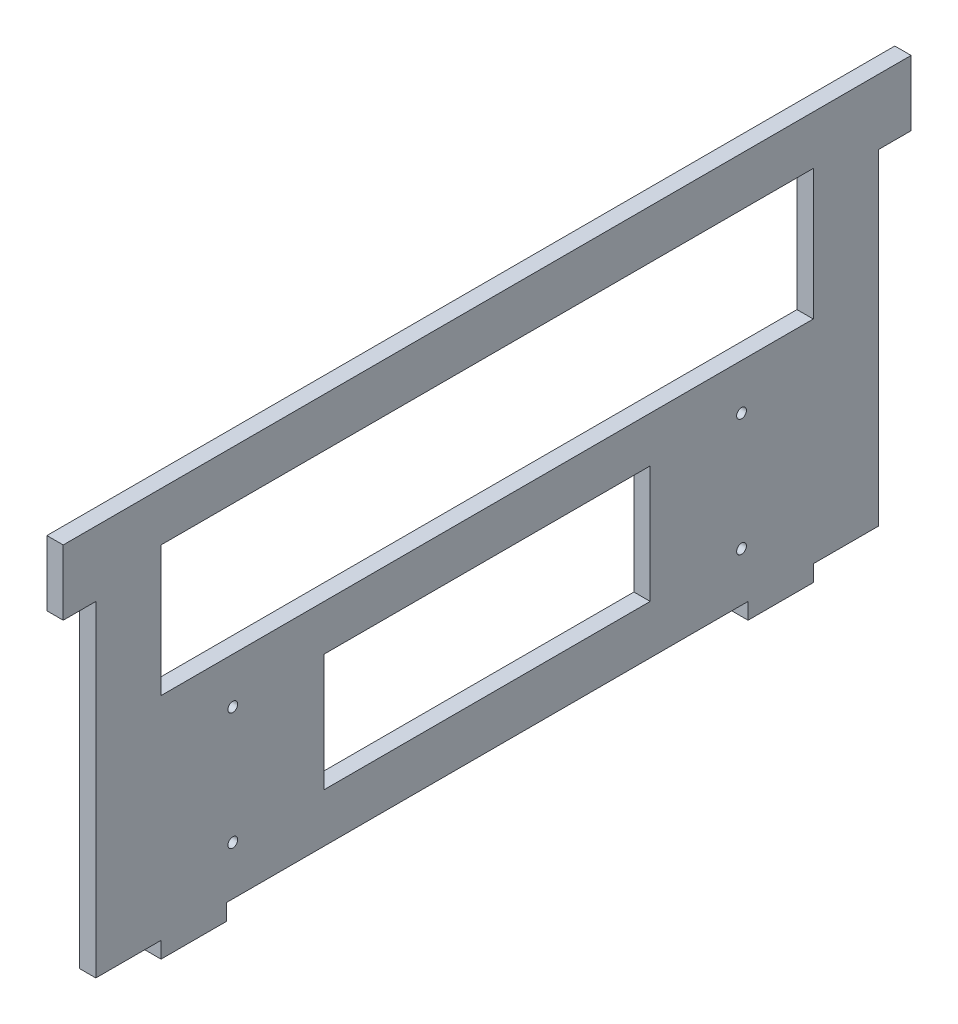
ISO-10303-21;
HEADER;
FILE_DESCRIPTION(('STEP AP214'),'2;1');
FILE_NAME('part.step','',(''),(''),'','','');
FILE_SCHEMA(('AUTOMOTIVE_DESIGN { 1 0 10303 214 1 1 1 1 }'));
ENDSEC;
DATA;
#1=APPLICATION_CONTEXT('core data for automotive mechanical design processes');
#2=APPLICATION_PROTOCOL_DEFINITION('international standard','automotive_design',2000,#1);
#3=PRODUCT_CONTEXT('',#1,'mechanical');
#4=PRODUCT('Part','Part','',(#3));
#5=PRODUCT_RELATED_PRODUCT_CATEGORY('part','',(#4));
#6=PRODUCT_DEFINITION_FORMATION('','',#4);
#7=PRODUCT_DEFINITION_CONTEXT('part definition',#1,'design');
#8=PRODUCT_DEFINITION('design','',#6,#7);
#9=PRODUCT_DEFINITION_SHAPE('','',#8);
#10=(LENGTH_UNIT() NAMED_UNIT(*) SI_UNIT(.MILLI.,.METRE.));
#11=(NAMED_UNIT(*) PLANE_ANGLE_UNIT() SI_UNIT($,.RADIAN.));
#12=(NAMED_UNIT(*) SI_UNIT($,.STERADIAN.) SOLID_ANGLE_UNIT());
#13=UNCERTAINTY_MEASURE_WITH_UNIT(LENGTH_MEASURE(1.E-05),#10,'distance_accuracy_value','');
#14=(GEOMETRIC_REPRESENTATION_CONTEXT(3) GLOBAL_UNCERTAINTY_ASSIGNED_CONTEXT((#13)) GLOBAL_UNIT_ASSIGNED_CONTEXT((#10,
#11,#12)) REPRESENTATION_CONTEXT('',''));
#15=CARTESIAN_POINT('',(0.,0.,0.));
#16=DIRECTION('',(0.,0.,1.));
#17=DIRECTION('',(1.,0.,0.));
#18=AXIS2_PLACEMENT_3D('',#15,#16,#17);
#19=CARTESIAN_POINT('',(5.,0.,-120.));
#20=DIRECTION('',(0.,0.,-1.));
#21=DIRECTION('',(0.,1.,0.));
#22=AXIS2_PLACEMENT_3D('',#19,#20,#21);
#23=PLANE('',#22);
#24=DIRECTION('',(0.,-1.,0.));
#25=VECTOR('',#24,1.);
#26=CARTESIAN_POINT('',(0.,0.,-120.));
#27=LINE('',#26,#25);
#28=CARTESIAN_POINT('',(0.,40.,-120.));
#29=VERTEX_POINT('',#28);
#30=CARTESIAN_POINT('',(0.,-60.,-120.));
#31=VERTEX_POINT('',#30);
#32=EDGE_CURVE('E286',#29,#31,#27,.T.);
#33=ORIENTED_EDGE('',*,*,#32,.F.);
#34=DIRECTION('',(-1.,0.,0.));
#35=VECTOR('',#34,1.);
#36=CARTESIAN_POINT('',(5.,40.,-120.));
#37=LINE('',#36,#35);
#38=CARTESIAN_POINT('',(5.,40.,-120.));
#39=VERTEX_POINT('',#38);
#40=EDGE_CURVE('E11',#39,#29,#37,.T.);
#41=ORIENTED_EDGE('',*,*,#40,.F.);
#42=DIRECTION('',(0.,-1.,0.));
#43=VECTOR('',#42,1.);
#44=CARTESIAN_POINT('',(5.,0.,-120.));
#45=LINE('',#44,#43);
#46=CARTESIAN_POINT('',(5.,-60.,-120.));
#47=VERTEX_POINT('',#46);
#48=EDGE_CURVE('E289',#39,#47,#45,.T.);
#49=ORIENTED_EDGE('',*,*,#48,.T.);
#50=DIRECTION('',(-1.,0.,0.));
#51=VECTOR('',#50,1.);
#52=CARTESIAN_POINT('',(5.,-60.,-120.));
#53=LINE('',#52,#51);
#54=EDGE_CURVE('E368',#47,#31,#53,.T.);
#55=ORIENTED_EDGE('',*,*,#54,.T.);
#56=EDGE_LOOP('',(#33,#41,#49,#55));
#57=FACE_BOUND('',#56,.T.);
#58=ADVANCED_FACE('F35',(#57),#23,.T.);
#59=CARTESIAN_POINT('',(5.,40.,0.));
#60=DIRECTION('',(0.,1.,0.));
#61=DIRECTION('',(0.,0.,1.));
#62=AXIS2_PLACEMENT_3D('',#59,#60,#61);
#63=PLANE('',#62);
#64=DIRECTION('',(0.,0.,-1.));
#65=VECTOR('',#64,1.);
#66=CARTESIAN_POINT('',(0.,40.,0.));
#67=LINE('',#66,#65);
#68=CARTESIAN_POINT('',(0.,40.,-130.));
#69=VERTEX_POINT('',#68);
#70=EDGE_CURVE('E330',#29,#69,#67,.T.);
#71=ORIENTED_EDGE('',*,*,#70,.T.);
#72=DIRECTION('',(-1.,0.,0.));
#73=VECTOR('',#72,1.);
#74=CARTESIAN_POINT('',(5.,40.,-130.));
#75=LINE('',#74,#73);
#76=CARTESIAN_POINT('',(5.,40.,-130.));
#77=VERTEX_POINT('',#76);
#78=EDGE_CURVE('E42',#77,#69,#75,.T.);
#79=ORIENTED_EDGE('',*,*,#78,.F.);
#80=DIRECTION('',(0.,0.,-1.));
#81=VECTOR('',#80,1.);
#82=CARTESIAN_POINT('',(5.,40.,0.));
#83=LINE('',#82,#81);
#84=EDGE_CURVE('E292',#39,#77,#83,.T.);
#85=ORIENTED_EDGE('',*,*,#84,.F.);
#86=ORIENTED_EDGE('',*,*,#40,.T.);
#87=EDGE_LOOP('',(#71,#79,#85,#86));
#88=FACE_BOUND('',#87,.T.);
#89=ADVANCED_FACE('F406',(#88),#63,.F.);
#90=CARTESIAN_POINT('',(5.,0.,-130.));
#91=DIRECTION('',(0.,0.,-1.));
#92=DIRECTION('',(-1.,0.,0.));
#93=AXIS2_PLACEMENT_3D('',#90,#91,#92);
#94=PLANE('',#93);
#95=DIRECTION('',(0.,-1.,0.));
#96=VECTOR('',#95,1.);
#97=CARTESIAN_POINT('',(0.,0.,-130.));
#98=LINE('',#97,#96);
#99=CARTESIAN_POINT('',(0.,60.,-130.));
#100=VERTEX_POINT('',#99);
#101=EDGE_CURVE('E333',#100,#69,#98,.T.);
#102=ORIENTED_EDGE('',*,*,#101,.F.);
#103=DIRECTION('',(-1.,0.,0.));
#104=VECTOR('',#103,1.);
#105=CARTESIAN_POINT('',(5.,60.,-130.));
#106=LINE('',#105,#104);
#107=CARTESIAN_POINT('',(5.,60.,-130.));
#108=VERTEX_POINT('',#107);
#109=EDGE_CURVE('E397',#108,#100,#106,.T.);
#110=ORIENTED_EDGE('',*,*,#109,.F.);
#111=DIRECTION('',(0.,-1.,0.));
#112=VECTOR('',#111,1.);
#113=CARTESIAN_POINT('',(5.,0.,-130.));
#114=LINE('',#113,#112);
#115=EDGE_CURVE('E295',#108,#77,#114,.T.);
#116=ORIENTED_EDGE('',*,*,#115,.T.);
#117=ORIENTED_EDGE('',*,*,#78,.T.);
#118=EDGE_LOOP('',(#102,#110,#116,#117));
#119=FACE_BOUND('',#118,.T.);
#120=ADVANCED_FACE('F401',(#119),#94,.T.);
#121=CARTESIAN_POINT('',(5.,60.,0.));
#122=DIRECTION('',(0.,1.,0.));
#123=DIRECTION('',(0.,0.,1.));
#124=AXIS2_PLACEMENT_3D('',#121,#122,#123);
#125=PLANE('',#124);
#126=DIRECTION('',(0.,0.,-1.));
#127=VECTOR('',#126,1.);
#128=CARTESIAN_POINT('',(0.,60.,0.));
#129=LINE('',#128,#127);
#130=CARTESIAN_POINT('',(0.,60.,130.));
#131=VERTEX_POINT('',#130);
#132=EDGE_CURVE('E336',#131,#100,#129,.T.);
#133=ORIENTED_EDGE('',*,*,#132,.F.);
#134=DIRECTION('',(-1.,0.,0.));
#135=VECTOR('',#134,1.);
#136=CARTESIAN_POINT('',(5.,60.,130.));
#137=LINE('',#136,#135);
#138=CARTESIAN_POINT('',(5.,60.,130.));
#139=VERTEX_POINT('',#138);
#140=EDGE_CURVE('E395',#139,#131,#137,.T.);
#141=ORIENTED_EDGE('',*,*,#140,.F.);
#142=DIRECTION('',(0.,0.,-1.));
#143=VECTOR('',#142,1.);
#144=CARTESIAN_POINT('',(5.,60.,0.));
#145=LINE('',#144,#143);
#146=EDGE_CURVE('E298',#139,#108,#145,.T.);
#147=ORIENTED_EDGE('',*,*,#146,.T.);
#148=ORIENTED_EDGE('',*,*,#109,.T.);
#149=EDGE_LOOP('',(#133,#141,#147,#148));
#150=FACE_BOUND('',#149,.T.);
#151=ADVANCED_FACE('F413',(#150),#125,.T.);
#152=CARTESIAN_POINT('',(5.,0.,130.));
#153=DIRECTION('',(0.,0.,-1.));
#154=DIRECTION('',(-1.,0.,0.));
#155=AXIS2_PLACEMENT_3D('',#152,#153,#154);
#156=PLANE('',#155);
#157=DIRECTION('',(0.,-1.,0.));
#158=VECTOR('',#157,1.);
#159=CARTESIAN_POINT('',(0.,0.,130.));
#160=LINE('',#159,#158);
#161=CARTESIAN_POINT('',(0.,40.,130.));
#162=VERTEX_POINT('',#161);
#163=EDGE_CURVE('E339',#131,#162,#160,.T.);
#164=ORIENTED_EDGE('',*,*,#163,.T.);
#165=DIRECTION('',(-1.,0.,0.));
#166=VECTOR('',#165,1.);
#167=CARTESIAN_POINT('',(5.,40.,130.));
#168=LINE('',#167,#166);
#169=CARTESIAN_POINT('',(5.,40.,130.));
#170=VERTEX_POINT('',#169);
#171=EDGE_CURVE('E393',#170,#162,#168,.T.);
#172=ORIENTED_EDGE('',*,*,#171,.F.);
#173=DIRECTION('',(0.,-1.,0.));
#174=VECTOR('',#173,1.);
#175=CARTESIAN_POINT('',(5.,0.,130.));
#176=LINE('',#175,#174);
#177=EDGE_CURVE('E301',#139,#170,#176,.T.);
#178=ORIENTED_EDGE('',*,*,#177,.F.);
#179=ORIENTED_EDGE('',*,*,#140,.T.);
#180=EDGE_LOOP('',(#164,#172,#178,#179));
#181=FACE_BOUND('',#180,.T.);
#182=ADVANCED_FACE('F470',(#181),#156,.F.);
#183=CARTESIAN_POINT('',(5.,40.,0.));
#184=DIRECTION('',(0.,-1.,0.));
#185=DIRECTION('',(0.,0.,-1.));
#186=AXIS2_PLACEMENT_3D('',#183,#184,#185);
#187=PLANE('',#186);
#188=DIRECTION('',(0.,0.,1.));
#189=VECTOR('',#188,1.);
#190=CARTESIAN_POINT('',(0.,40.,0.));
#191=LINE('',#190,#189);
#192=CARTESIAN_POINT('',(0.,40.,120.));
#193=VERTEX_POINT('',#192);
#194=EDGE_CURVE('E342',#193,#162,#191,.T.);
#195=ORIENTED_EDGE('',*,*,#194,.F.);
#196=DIRECTION('',(-1.,0.,0.));
#197=VECTOR('',#196,1.);
#198=CARTESIAN_POINT('',(5.,40.,120.));
#199=LINE('',#198,#197);
#200=CARTESIAN_POINT('',(5.,40.,120.));
#201=VERTEX_POINT('',#200);
#202=EDGE_CURVE('E391',#201,#193,#199,.T.);
#203=ORIENTED_EDGE('',*,*,#202,.F.);
#204=DIRECTION('',(0.,0.,1.));
#205=VECTOR('',#204,1.);
#206=CARTESIAN_POINT('',(5.,40.,0.));
#207=LINE('',#206,#205);
#208=EDGE_CURVE('E303',#201,#170,#207,.T.);
#209=ORIENTED_EDGE('',*,*,#208,.T.);
#210=ORIENTED_EDGE('',*,*,#171,.T.);
#211=EDGE_LOOP('',(#195,#203,#209,#210));
#212=FACE_BOUND('',#211,.T.);
#213=ADVANCED_FACE('F465',(#212),#187,.T.);
#214=CARTESIAN_POINT('',(5.,0.,120.));
#215=DIRECTION('',(0.,0.,-1.));
#216=DIRECTION('',(0.,1.,0.));
#217=AXIS2_PLACEMENT_3D('',#214,#215,#216);
#218=PLANE('',#217);
#219=DIRECTION('',(0.,-1.,0.));
#220=VECTOR('',#219,1.);
#221=CARTESIAN_POINT('',(0.,0.,120.));
#222=LINE('',#221,#220);
#223=CARTESIAN_POINT('',(0.,-60.,120.));
#224=VERTEX_POINT('',#223);
#225=EDGE_CURVE('E345',#193,#224,#222,.T.);
#226=ORIENTED_EDGE('',*,*,#225,.T.);
#227=DIRECTION('',(-1.,0.,0.));
#228=VECTOR('',#227,1.);
#229=CARTESIAN_POINT('',(5.,-60.,120.));
#230=LINE('',#229,#228);
#231=CARTESIAN_POINT('',(5.,-60.,120.));
#232=VERTEX_POINT('',#231);
#233=EDGE_CURVE('E388',#232,#224,#230,.T.);
#234=ORIENTED_EDGE('',*,*,#233,.F.);
#235=DIRECTION('',(0.,-1.,0.));
#236=VECTOR('',#235,1.);
#237=CARTESIAN_POINT('',(5.,0.,120.));
#238=LINE('',#237,#236);
#239=EDGE_CURVE('E306',#201,#232,#238,.T.);
#240=ORIENTED_EDGE('',*,*,#239,.F.);
#241=ORIENTED_EDGE('',*,*,#202,.T.);
#242=EDGE_LOOP('',(#226,#234,#240,#241));
#243=FACE_BOUND('',#242,.T.);
#244=ADVANCED_FACE('F471',(#243),#218,.F.);
#245=CARTESIAN_POINT('',(5.,-60.,0.));
#246=DIRECTION('',(0.,1.,0.));
#247=DIRECTION('',(0.,0.,1.));
#248=AXIS2_PLACEMENT_3D('',#245,#246,#247);
#249=PLANE('',#248);
#250=DIRECTION('',(0.,0.,-1.));
#251=VECTOR('',#250,1.);
#252=CARTESIAN_POINT('',(0.,-60.,0.));
#253=LINE('',#252,#251);
#254=CARTESIAN_POINT('',(0.,-60.,99.9999999999999));
#255=VERTEX_POINT('',#254);
#256=EDGE_CURVE('E347',#224,#255,#253,.T.);
#257=ORIENTED_EDGE('',*,*,#256,.T.);
#258=DIRECTION('',(-1.,0.,0.));
#259=VECTOR('',#258,1.);
#260=CARTESIAN_POINT('',(5.,-60.,99.9999999999999));
#261=LINE('',#260,#259);
#262=CARTESIAN_POINT('',(5.,-60.,99.9999999999999));
#263=VERTEX_POINT('',#262);
#264=EDGE_CURVE('E385',#263,#255,#261,.T.);
#265=ORIENTED_EDGE('',*,*,#264,.F.);
#266=DIRECTION('',(0.,0.,-1.));
#267=VECTOR('',#266,1.);
#268=CARTESIAN_POINT('',(5.,-60.,0.));
#269=LINE('',#268,#267);
#270=EDGE_CURVE('E308',#232,#263,#269,.T.);
#271=ORIENTED_EDGE('',*,*,#270,.F.);
#272=ORIENTED_EDGE('',*,*,#233,.T.);
#273=EDGE_LOOP('',(#257,#265,#271,#272));
#274=FACE_BOUND('',#273,.T.);
#275=ADVANCED_FACE('F459',(#274),#249,.F.);
#276=CARTESIAN_POINT('',(5.,0.,99.9999999999999));
#277=DIRECTION('',(0.,0.,-1.));
#278=DIRECTION('',(-1.,0.,0.));
#279=AXIS2_PLACEMENT_3D('',#276,#277,#278);
#280=PLANE('',#279);
#281=DIRECTION('',(0.,-1.,0.));
#282=VECTOR('',#281,1.);
#283=CARTESIAN_POINT('',(0.,0.,99.9999999999999));
#284=LINE('',#283,#282);
#285=CARTESIAN_POINT('',(0.,-65.,99.9999999999999));
#286=VERTEX_POINT('',#285);
#287=EDGE_CURVE('E349',#255,#286,#284,.T.);
#288=ORIENTED_EDGE('',*,*,#287,.T.);
#289=DIRECTION('',(-1.,0.,0.));
#290=VECTOR('',#289,1.);
#291=CARTESIAN_POINT('',(5.,-65.,99.9999999999999));
#292=LINE('',#291,#290);
#293=CARTESIAN_POINT('',(5.,-65.,99.9999999999999));
#294=VERTEX_POINT('',#293);
#295=EDGE_CURVE('E383',#294,#286,#292,.T.);
#296=ORIENTED_EDGE('',*,*,#295,.F.);
#297=DIRECTION('',(0.,-1.,0.));
#298=VECTOR('',#297,1.);
#299=CARTESIAN_POINT('',(5.,0.,99.9999999999999));
#300=LINE('',#299,#298);
#301=EDGE_CURVE('E310',#263,#294,#300,.T.);
#302=ORIENTED_EDGE('',*,*,#301,.F.);
#303=ORIENTED_EDGE('',*,*,#264,.T.);
#304=EDGE_LOOP('',(#288,#296,#302,#303));
#305=FACE_BOUND('',#304,.T.);
#306=ADVANCED_FACE('F455',(#305),#280,.F.);
#307=CARTESIAN_POINT('',(5.,-65.,0.));
#308=DIRECTION('',(0.,-1.,0.));
#309=DIRECTION('',(0.,0.,-1.));
#310=AXIS2_PLACEMENT_3D('',#307,#308,#309);
#311=PLANE('',#310);
#312=DIRECTION('',(0.,0.,1.));
#313=VECTOR('',#312,1.);
#314=CARTESIAN_POINT('',(0.,-65.,0.));
#315=LINE('',#314,#313);
#316=CARTESIAN_POINT('',(0.,-65.,79.9999999999999));
#317=VERTEX_POINT('',#316);
#318=EDGE_CURVE('E353',#317,#286,#315,.T.);
#319=ORIENTED_EDGE('',*,*,#318,.F.);
#320=DIRECTION('',(-1.,0.,0.));
#321=VECTOR('',#320,1.);
#322=CARTESIAN_POINT('',(5.,-65.,79.9999999999999));
#323=LINE('',#322,#321);
#324=CARTESIAN_POINT('',(5.,-65.,79.9999999999999));
#325=VERTEX_POINT('',#324);
#326=EDGE_CURVE('E381',#325,#317,#323,.T.);
#327=ORIENTED_EDGE('',*,*,#326,.F.);
#328=DIRECTION('',(0.,0.,1.));
#329=VECTOR('',#328,1.);
#330=CARTESIAN_POINT('',(5.,-65.,0.));
#331=LINE('',#330,#329);
#332=EDGE_CURVE('E314',#325,#294,#331,.T.);
#333=ORIENTED_EDGE('',*,*,#332,.T.);
#334=ORIENTED_EDGE('',*,*,#295,.T.);
#335=EDGE_LOOP('',(#319,#327,#333,#334));
#336=FACE_BOUND('',#335,.T.);
#337=ADVANCED_FACE('F450',(#336),#311,.T.);
#338=CARTESIAN_POINT('',(5.,0.,79.9999999999999));
#339=DIRECTION('',(0.,0.,-1.));
#340=DIRECTION('',(-1.,0.,0.));
#341=AXIS2_PLACEMENT_3D('',#338,#339,#340);
#342=PLANE('',#341);
#343=DIRECTION('',(0.,-1.,0.));
#344=VECTOR('',#343,1.);
#345=CARTESIAN_POINT('',(0.,0.,79.9999999999999));
#346=LINE('',#345,#344);
#347=CARTESIAN_POINT('',(0.,-60.,79.9999999999999));
#348=VERTEX_POINT('',#347);
#349=EDGE_CURVE('E356',#348,#317,#346,.T.);
#350=ORIENTED_EDGE('',*,*,#349,.F.);
#351=DIRECTION('',(-1.,0.,0.));
#352=VECTOR('',#351,1.);
#353=CARTESIAN_POINT('',(5.,-60.,79.9999999999999));
#354=LINE('',#353,#352);
#355=CARTESIAN_POINT('',(5.,-60.,79.9999999999999));
#356=VERTEX_POINT('',#355);
#357=EDGE_CURVE('E379',#356,#348,#354,.T.);
#358=ORIENTED_EDGE('',*,*,#357,.F.);
#359=DIRECTION('',(0.,-1.,0.));
#360=VECTOR('',#359,1.);
#361=CARTESIAN_POINT('',(5.,0.,79.9999999999999));
#362=LINE('',#361,#360);
#363=EDGE_CURVE('E317',#356,#325,#362,.T.);
#364=ORIENTED_EDGE('',*,*,#363,.T.);
#365=ORIENTED_EDGE('',*,*,#326,.T.);
#366=EDGE_LOOP('',(#350,#358,#364,#365));
#367=FACE_BOUND('',#366,.T.);
#368=ADVANCED_FACE('F445',(#367),#342,.T.);
#369=CARTESIAN_POINT('',(0.,-60.,-80.0000000000001));
#370=VERTEX_POINT('',#369);
#371=EDGE_CURVE('E350',#348,#370,#253,.T.);
#372=ORIENTED_EDGE('',*,*,#371,.T.);
#373=DIRECTION('',(-1.,0.,0.));
#374=VECTOR('',#373,1.);
#375=CARTESIAN_POINT('',(5.,-60.,-80.0000000000001));
#376=LINE('',#375,#374);
#377=CARTESIAN_POINT('',(5.,-60.,-80.0000000000001));
#378=VERTEX_POINT('',#377);
#379=EDGE_CURVE('E376',#378,#370,#376,.T.);
#380=ORIENTED_EDGE('',*,*,#379,.F.);
#381=EDGE_CURVE('E312',#356,#378,#269,.T.);
#382=ORIENTED_EDGE('',*,*,#381,.F.);
#383=ORIENTED_EDGE('',*,*,#357,.T.);
#384=EDGE_LOOP('',(#372,#380,#382,#383));
#385=FACE_BOUND('',#384,.T.);
#386=ADVANCED_FACE('F442',(#385),#249,.F.);
#387=CARTESIAN_POINT('',(5.,0.,-80.0000000000001));
#388=DIRECTION('',(0.,0.,-1.));
#389=DIRECTION('',(-1.,0.,0.));
#390=AXIS2_PLACEMENT_3D('',#387,#388,#389);
#391=PLANE('',#390);
#392=DIRECTION('',(0.,-1.,0.));
#393=VECTOR('',#392,1.);
#394=CARTESIAN_POINT('',(0.,0.,-80.0000000000001));
#395=LINE('',#394,#393);
#396=CARTESIAN_POINT('',(0.,-65.,-80.0000000000001));
#397=VERTEX_POINT('',#396);
#398=EDGE_CURVE('E359',#370,#397,#395,.T.);
#399=ORIENTED_EDGE('',*,*,#398,.T.);
#400=DIRECTION('',(-1.,0.,0.));
#401=VECTOR('',#400,1.);
#402=CARTESIAN_POINT('',(5.,-65.,-80.0000000000001));
#403=LINE('',#402,#401);
#404=CARTESIAN_POINT('',(5.,-65.,-80.0000000000001));
#405=VERTEX_POINT('',#404);
#406=EDGE_CURVE('E374',#405,#397,#403,.T.);
#407=ORIENTED_EDGE('',*,*,#406,.F.);
#408=DIRECTION('',(0.,-1.,0.));
#409=VECTOR('',#408,1.);
#410=CARTESIAN_POINT('',(5.,0.,-80.0000000000001));
#411=LINE('',#410,#409);
#412=EDGE_CURVE('E320',#378,#405,#411,.T.);
#413=ORIENTED_EDGE('',*,*,#412,.F.);
#414=ORIENTED_EDGE('',*,*,#379,.T.);
#415=EDGE_LOOP('',(#399,#407,#413,#414));
#416=FACE_BOUND('',#415,.T.);
#417=ADVANCED_FACE('F437',(#416),#391,.F.);
#418=CARTESIAN_POINT('',(5.,-65.,0.));
#419=DIRECTION('',(0.,-1.,0.));
#420=DIRECTION('',(0.,0.,-1.));
#421=AXIS2_PLACEMENT_3D('',#418,#419,#420);
#422=PLANE('',#421);
#423=DIRECTION('',(0.,0.,1.));
#424=VECTOR('',#423,1.);
#425=CARTESIAN_POINT('',(0.,-65.,0.));
#426=LINE('',#425,#424);
#427=CARTESIAN_POINT('',(0.,-65.,-100.));
#428=VERTEX_POINT('',#427);
#429=EDGE_CURVE('E362',#428,#397,#426,.T.);
#430=ORIENTED_EDGE('',*,*,#429,.F.);
#431=DIRECTION('',(-1.,0.,0.));
#432=VECTOR('',#431,1.);
#433=CARTESIAN_POINT('',(5.,-65.,-100.));
#434=LINE('',#433,#432);
#435=CARTESIAN_POINT('',(5.,-65.,-100.));
#436=VERTEX_POINT('',#435);
#437=EDGE_CURVE('E372',#436,#428,#434,.T.);
#438=ORIENTED_EDGE('',*,*,#437,.F.);
#439=DIRECTION('',(0.,0.,1.));
#440=VECTOR('',#439,1.);
#441=CARTESIAN_POINT('',(5.,-65.,0.));
#442=LINE('',#441,#440);
#443=EDGE_CURVE('E322',#436,#405,#442,.T.);
#444=ORIENTED_EDGE('',*,*,#443,.T.);
#445=ORIENTED_EDGE('',*,*,#406,.T.);
#446=EDGE_LOOP('',(#430,#438,#444,#445));
#447=FACE_BOUND('',#446,.T.);
#448=ADVANCED_FACE('F431',(#447),#422,.T.);
#449=CARTESIAN_POINT('',(5.,0.,-100.));
#450=DIRECTION('',(0.,0.,-1.));
#451=DIRECTION('',(-1.,0.,0.));
#452=AXIS2_PLACEMENT_3D('',#449,#450,#451);
#453=PLANE('',#452);
#454=DIRECTION('',(0.,-1.,0.));
#455=VECTOR('',#454,1.);
#456=CARTESIAN_POINT('',(0.,0.,-100.));
#457=LINE('',#456,#455);
#458=CARTESIAN_POINT('',(0.,-60.,-100.));
#459=VERTEX_POINT('',#458);
#460=EDGE_CURVE('E365',#459,#428,#457,.T.);
#461=ORIENTED_EDGE('',*,*,#460,.F.);
#462=DIRECTION('',(-1.,0.,0.));
#463=VECTOR('',#462,1.);
#464=CARTESIAN_POINT('',(5.,-60.,-100.));
#465=LINE('',#464,#463);
#466=CARTESIAN_POINT('',(5.,-60.,-100.));
#467=VERTEX_POINT('',#466);
#468=EDGE_CURVE('E370',#467,#459,#465,.T.);
#469=ORIENTED_EDGE('',*,*,#468,.F.);
#470=DIRECTION('',(0.,-1.,0.));
#471=VECTOR('',#470,1.);
#472=CARTESIAN_POINT('',(5.,0.,-100.));
#473=LINE('',#472,#471);
#474=EDGE_CURVE('E325',#467,#436,#473,.T.);
#475=ORIENTED_EDGE('',*,*,#474,.T.);
#476=ORIENTED_EDGE('',*,*,#437,.T.);
#477=EDGE_LOOP('',(#461,#469,#475,#476));
#478=FACE_BOUND('',#477,.T.);
#479=ADVANCED_FACE('F427',(#478),#453,.T.);
#480=EDGE_CURVE('E293',#459,#31,#253,.T.);
#481=ORIENTED_EDGE('',*,*,#480,.T.);
#482=ORIENTED_EDGE('',*,*,#54,.F.);
#483=EDGE_CURVE('E311',#467,#47,#269,.T.);
#484=ORIENTED_EDGE('',*,*,#483,.F.);
#485=ORIENTED_EDGE('',*,*,#468,.T.);
#486=EDGE_LOOP('',(#481,#482,#484,#485));
#487=FACE_BOUND('',#486,.T.);
#488=ADVANCED_FACE('F479',(#487),#249,.F.);
#489=CARTESIAN_POINT('',(5.,0.,0.));
#490=DIRECTION('',(1.,0.,0.));
#491=DIRECTION('',(0.,0.,-1.));
#492=AXIS2_PLACEMENT_3D('',#489,#490,#491);
#493=PLANE('',#492);
#494=CARTESIAN_POINT('',(5.,-8.99999999999997,78.));
#495=DIRECTION('',(-1.,0.,0.));
#496=DIRECTION('',(0.,0.,1.));
#497=AXIS2_PLACEMENT_3D('',#494,#495,#496);
#498=CIRCLE('',#497,1.5);
#499=CARTESIAN_POINT('',(5.,-8.99999999999997,79.5));
#500=VERTEX_POINT('',#499);
#501=EDGE_CURVE('E241',#500,#500,#498,.T.);
#502=ORIENTED_EDGE('',*,*,#501,.T.);
#503=EDGE_LOOP('',(#502));
#504=FACE_BOUND('',#503,.T.);
#505=CARTESIAN_POINT('',(5.,-45.,-78.));
#506=DIRECTION('',(-1.,0.,0.));
#507=DIRECTION('',(0.,0.,1.));
#508=AXIS2_PLACEMENT_3D('',#505,#506,#507);
#509=CIRCLE('',#508,1.5);
#510=CARTESIAN_POINT('',(5.,-45.,-76.5));
#511=VERTEX_POINT('',#510);
#512=EDGE_CURVE('E226',#511,#511,#509,.T.);
#513=ORIENTED_EDGE('',*,*,#512,.T.);
#514=EDGE_LOOP('',(#513));
#515=FACE_BOUND('',#514,.T.);
#516=DIRECTION('',(0.,1.,0.));
#517=VECTOR('',#516,1.);
#518=CARTESIAN_POINT('',(5.,45.,100.));
#519=LINE('',#518,#517);
#520=CARTESIAN_POINT('',(5.,5.00000000000002,100.));
#521=VERTEX_POINT('',#520);
#522=CARTESIAN_POINT('',(5.,45.,100.));
#523=VERTEX_POINT('',#522);
#524=EDGE_CURVE('E198',#521,#523,#519,.T.);
#525=ORIENTED_EDGE('',*,*,#524,.T.);
#526=DIRECTION('',(0.,0.,-1.));
#527=VECTOR('',#526,1.);
#528=CARTESIAN_POINT('',(5.,45.,-100.));
#529=LINE('',#528,#527);
#530=CARTESIAN_POINT('',(5.,45.,-100.));
#531=VERTEX_POINT('',#530);
#532=EDGE_CURVE('E209',#523,#531,#529,.T.);
#533=ORIENTED_EDGE('',*,*,#532,.T.);
#534=DIRECTION('',(0.,-1.,0.));
#535=VECTOR('',#534,1.);
#536=CARTESIAN_POINT('',(5.,45.,-100.));
#537=LINE('',#536,#535);
#538=CARTESIAN_POINT('',(5.,5.00000000000002,-100.));
#539=VERTEX_POINT('',#538);
#540=EDGE_CURVE('E49',#531,#539,#537,.T.);
#541=ORIENTED_EDGE('',*,*,#540,.T.);
#542=DIRECTION('',(0.,0.,1.));
#543=VECTOR('',#542,1.);
#544=CARTESIAN_POINT('',(5.,5.00000000000002,-100.));
#545=LINE('',#544,#543);
#546=EDGE_CURVE('E206',#539,#521,#545,.T.);
#547=ORIENTED_EDGE('',*,*,#546,.T.);
#548=EDGE_LOOP('',(#525,#533,#541,#547));
#549=FACE_BOUND('',#548,.T.);
#550=DIRECTION('',(0.,1.,0.));
#551=VECTOR('',#550,1.);
#552=CARTESIAN_POINT('',(5.,-8.99999999999997,50.));
#553=LINE('',#552,#551);
#554=CARTESIAN_POINT('',(5.,-45.,50.));
#555=VERTEX_POINT('',#554);
#556=CARTESIAN_POINT('',(5.,-8.99999999999997,50.));
#557=VERTEX_POINT('',#556);
#558=EDGE_CURVE('E255',#555,#557,#553,.T.);
#559=ORIENTED_EDGE('',*,*,#558,.T.);
#560=DIRECTION('',(0.,0.,-1.));
#561=VECTOR('',#560,1.);
#562=CARTESIAN_POINT('',(5.,-8.99999999999997,-50.));
#563=LINE('',#562,#561);
#564=CARTESIAN_POINT('',(5.,-8.99999999999997,-50.));
#565=VERTEX_POINT('',#564);
#566=EDGE_CURVE('E258',#557,#565,#563,.T.);
#567=ORIENTED_EDGE('',*,*,#566,.T.);
#568=DIRECTION('',(0.,-1.,0.));
#569=VECTOR('',#568,1.);
#570=CARTESIAN_POINT('',(5.,-8.99999999999997,-50.));
#571=LINE('',#570,#569);
#572=CARTESIAN_POINT('',(5.,-45.,-50.));
#573=VERTEX_POINT('',#572);
#574=EDGE_CURVE('E57',#565,#573,#571,.T.);
#575=ORIENTED_EDGE('',*,*,#574,.T.);
#576=DIRECTION('',(0.,0.,1.));
#577=VECTOR('',#576,1.);
#578=CARTESIAN_POINT('',(5.,-45.,-50.));
#579=LINE('',#578,#577);
#580=EDGE_CURVE('E263',#573,#555,#579,.T.);
#581=ORIENTED_EDGE('',*,*,#580,.T.);
#582=EDGE_LOOP('',(#559,#567,#575,#581));
#583=FACE_BOUND('',#582,.T.);
#584=CARTESIAN_POINT('',(5.,-45.,78.));
#585=DIRECTION('',(-1.,0.,0.));
#586=DIRECTION('',(0.,0.,1.));
#587=AXIS2_PLACEMENT_3D('',#584,#585,#586);
#588=CIRCLE('',#587,1.5);
#589=CARTESIAN_POINT('',(5.,-45.,79.5));
#590=VERTEX_POINT('',#589);
#591=EDGE_CURVE('E247',#590,#590,#588,.T.);
#592=ORIENTED_EDGE('',*,*,#591,.T.);
#593=EDGE_LOOP('',(#592));
#594=FACE_BOUND('',#593,.T.);
#595=CARTESIAN_POINT('',(5.,-8.99999999999997,-78.));
#596=DIRECTION('',(-1.,0.,0.));
#597=DIRECTION('',(0.,0.,1.));
#598=AXIS2_PLACEMENT_3D('',#595,#596,#597);
#599=CIRCLE('',#598,1.5);
#600=CARTESIAN_POINT('',(5.,-8.99999999999997,-76.5));
#601=VERTEX_POINT('',#600);
#602=EDGE_CURVE('E283',#601,#601,#599,.T.);
#603=ORIENTED_EDGE('',*,*,#602,.T.);
#604=EDGE_LOOP('',(#603));
#605=FACE_BOUND('',#604,.T.);
#606=ORIENTED_EDGE('',*,*,#48,.F.);
#607=ORIENTED_EDGE('',*,*,#84,.T.);
#608=ORIENTED_EDGE('',*,*,#115,.F.);
#609=ORIENTED_EDGE('',*,*,#146,.F.);
#610=ORIENTED_EDGE('',*,*,#177,.T.);
#611=ORIENTED_EDGE('',*,*,#208,.F.);
#612=ORIENTED_EDGE('',*,*,#239,.T.);
#613=ORIENTED_EDGE('',*,*,#270,.T.);
#614=ORIENTED_EDGE('',*,*,#301,.T.);
#615=ORIENTED_EDGE('',*,*,#332,.F.);
#616=ORIENTED_EDGE('',*,*,#363,.F.);
#617=ORIENTED_EDGE('',*,*,#381,.T.);
#618=ORIENTED_EDGE('',*,*,#412,.T.);
#619=ORIENTED_EDGE('',*,*,#443,.F.);
#620=ORIENTED_EDGE('',*,*,#474,.F.);
#621=ORIENTED_EDGE('',*,*,#483,.T.);
#622=EDGE_LOOP('',(#606,#607,#608,#609,#610,#611,#612,#613,#614,#615,#616,#617,#618,#619,#620,#621));
#623=FACE_BOUND('',#622,.T.);
#624=ADVANCED_FACE('F213',(#504,#515,#549,#583,#594,#605,#623),#493,.T.);
#625=CARTESIAN_POINT('',(0.,0.,0.));
#626=DIRECTION('',(1.,0.,0.));
#627=DIRECTION('',(0.,0.,-1.));
#628=AXIS2_PLACEMENT_3D('',#625,#626,#627);
#629=PLANE('',#628);
#630=CARTESIAN_POINT('',(0.,-8.99999999999997,78.));
#631=DIRECTION('',(-1.,0.,0.));
#632=DIRECTION('',(0.,0.,1.));
#633=AXIS2_PLACEMENT_3D('',#630,#631,#632);
#634=CIRCLE('',#633,1.5);
#635=CARTESIAN_POINT('',(0.,-8.99999999999997,79.5));
#636=VERTEX_POINT('',#635);
#637=EDGE_CURVE('E244',#636,#636,#634,.T.);
#638=ORIENTED_EDGE('',*,*,#637,.F.);
#639=EDGE_LOOP('',(#638));
#640=FACE_BOUND('',#639,.T.);
#641=CARTESIAN_POINT('',(0.,-45.,-78.));
#642=DIRECTION('',(-1.,0.,0.));
#643=DIRECTION('',(0.,0.,1.));
#644=AXIS2_PLACEMENT_3D('',#641,#642,#643);
#645=CIRCLE('',#644,1.5);
#646=CARTESIAN_POINT('',(0.,-45.,-76.5));
#647=VERTEX_POINT('',#646);
#648=EDGE_CURVE('E238',#647,#647,#645,.T.);
#649=ORIENTED_EDGE('',*,*,#648,.F.);
#650=EDGE_LOOP('',(#649));
#651=FACE_BOUND('',#650,.T.);
#652=DIRECTION('',(0.,0.,-1.));
#653=VECTOR('',#652,1.);
#654=CARTESIAN_POINT('',(0.,45.,-100.));
#655=LINE('',#654,#653);
#656=CARTESIAN_POINT('',(0.,45.,100.));
#657=VERTEX_POINT('',#656);
#658=CARTESIAN_POINT('',(0.,45.,-100.));
#659=VERTEX_POINT('',#658);
#660=EDGE_CURVE('E225',#657,#659,#655,.T.);
#661=ORIENTED_EDGE('',*,*,#660,.F.);
#662=DIRECTION('',(0.,1.,0.));
#663=VECTOR('',#662,1.);
#664=CARTESIAN_POINT('',(0.,45.,100.));
#665=LINE('',#664,#663);
#666=CARTESIAN_POINT('',(0.,5.00000000000002,100.));
#667=VERTEX_POINT('',#666);
#668=EDGE_CURVE('E201',#667,#657,#665,.T.);
#669=ORIENTED_EDGE('',*,*,#668,.F.);
#670=DIRECTION('',(0.,0.,1.));
#671=VECTOR('',#670,1.);
#672=CARTESIAN_POINT('',(0.,5.00000000000002,-100.));
#673=LINE('',#672,#671);
#674=CARTESIAN_POINT('',(0.,5.00000000000002,-100.));
#675=VERTEX_POINT('',#674);
#676=EDGE_CURVE('E216',#675,#667,#673,.T.);
#677=ORIENTED_EDGE('',*,*,#676,.F.);
#678=DIRECTION('',(0.,-1.,0.));
#679=VECTOR('',#678,1.);
#680=CARTESIAN_POINT('',(0.,45.,-100.));
#681=LINE('',#680,#679);
#682=EDGE_CURVE('E219',#659,#675,#681,.T.);
#683=ORIENTED_EDGE('',*,*,#682,.F.);
#684=EDGE_LOOP('',(#661,#669,#677,#683));
#685=FACE_BOUND('',#684,.T.);
#686=DIRECTION('',(0.,0.,-1.));
#687=VECTOR('',#686,1.);
#688=CARTESIAN_POINT('',(0.,-8.99999999999997,-50.));
#689=LINE('',#688,#687);
#690=CARTESIAN_POINT('',(0.,-8.99999999999997,50.));
#691=VERTEX_POINT('',#690);
#692=CARTESIAN_POINT('',(0.,-8.99999999999997,-50.));
#693=VERTEX_POINT('',#692);
#694=EDGE_CURVE('E268',#691,#693,#689,.T.);
#695=ORIENTED_EDGE('',*,*,#694,.F.);
#696=DIRECTION('',(0.,1.,0.));
#697=VECTOR('',#696,1.);
#698=CARTESIAN_POINT('',(0.,-8.99999999999997,50.));
#699=LINE('',#698,#697);
#700=CARTESIAN_POINT('',(0.,-45.,50.));
#701=VERTEX_POINT('',#700);
#702=EDGE_CURVE('E232',#701,#691,#699,.T.);
#703=ORIENTED_EDGE('',*,*,#702,.F.);
#704=DIRECTION('',(0.,0.,1.));
#705=VECTOR('',#704,1.);
#706=CARTESIAN_POINT('',(0.,-45.,-50.));
#707=LINE('',#706,#705);
#708=CARTESIAN_POINT('',(0.,-45.,-50.));
#709=VERTEX_POINT('',#708);
#710=EDGE_CURVE('E259',#709,#701,#707,.T.);
#711=ORIENTED_EDGE('',*,*,#710,.F.);
#712=DIRECTION('',(0.,-1.,0.));
#713=VECTOR('',#712,1.);
#714=CARTESIAN_POINT('',(0.,-8.99999999999997,-50.));
#715=LINE('',#714,#713);
#716=EDGE_CURVE('E271',#693,#709,#715,.T.);
#717=ORIENTED_EDGE('',*,*,#716,.F.);
#718=EDGE_LOOP('',(#695,#703,#711,#717));
#719=FACE_BOUND('',#718,.T.);
#720=CARTESIAN_POINT('',(0.,-45.,78.));
#721=DIRECTION('',(-1.,0.,0.));
#722=DIRECTION('',(0.,0.,1.));
#723=AXIS2_PLACEMENT_3D('',#720,#721,#722);
#724=CIRCLE('',#723,1.5);
#725=CARTESIAN_POINT('',(0.,-45.,79.5));
#726=VERTEX_POINT('',#725);
#727=EDGE_CURVE('E251',#726,#726,#724,.T.);
#728=ORIENTED_EDGE('',*,*,#727,.F.);
#729=EDGE_LOOP('',(#728));
#730=FACE_BOUND('',#729,.T.);
#731=CARTESIAN_POINT('',(0.,-8.99999999999997,-78.));
#732=DIRECTION('',(-1.,0.,0.));
#733=DIRECTION('',(0.,0.,1.));
#734=AXIS2_PLACEMENT_3D('',#731,#732,#733);
#735=CIRCLE('',#734,1.5);
#736=CARTESIAN_POINT('',(0.,-8.99999999999997,-76.5));
#737=VERTEX_POINT('',#736);
#738=EDGE_CURVE('E250',#737,#737,#735,.T.);
#739=ORIENTED_EDGE('',*,*,#738,.F.);
#740=EDGE_LOOP('',(#739));
#741=FACE_BOUND('',#740,.T.);
#742=ORIENTED_EDGE('',*,*,#32,.T.);
#743=ORIENTED_EDGE('',*,*,#480,.F.);
#744=ORIENTED_EDGE('',*,*,#460,.T.);
#745=ORIENTED_EDGE('',*,*,#429,.T.);
#746=ORIENTED_EDGE('',*,*,#398,.F.);
#747=ORIENTED_EDGE('',*,*,#371,.F.);
#748=ORIENTED_EDGE('',*,*,#349,.T.);
#749=ORIENTED_EDGE('',*,*,#318,.T.);
#750=ORIENTED_EDGE('',*,*,#287,.F.);
#751=ORIENTED_EDGE('',*,*,#256,.F.);
#752=ORIENTED_EDGE('',*,*,#225,.F.);
#753=ORIENTED_EDGE('',*,*,#194,.T.);
#754=ORIENTED_EDGE('',*,*,#163,.F.);
#755=ORIENTED_EDGE('',*,*,#132,.T.);
#756=ORIENTED_EDGE('',*,*,#101,.T.);
#757=ORIENTED_EDGE('',*,*,#70,.F.);
#758=EDGE_LOOP('',(#742,#743,#744,#745,#746,#747,#748,#749,#750,#751,#752,#753,#754,#755,#756,#757));
#759=FACE_BOUND('',#758,.T.);
#760=ADVANCED_FACE('F409',(#640,#651,#685,#719,#730,#741,#759),#629,.F.);
#761=CARTESIAN_POINT('',(5.,-8.99999999999997,-78.));
#762=DIRECTION('',(-1.,0.,0.));
#763=DIRECTION('',(0.,0.,1.));
#764=AXIS2_PLACEMENT_3D('',#761,#762,#763);
#765=CYLINDRICAL_SURFACE('',#764,1.5);
#766=ORIENTED_EDGE('',*,*,#602,.F.);
#767=EDGE_LOOP('',(#766));
#768=FACE_BOUND('',#767,.T.);
#769=ORIENTED_EDGE('',*,*,#738,.T.);
#770=EDGE_LOOP('',(#769));
#771=FACE_BOUND('',#770,.T.);
#772=ADVANCED_FACE('F596',(#768,#771),#765,.F.);
#773=CARTESIAN_POINT('',(5.,-45.,78.));
#774=DIRECTION('',(-1.,0.,0.));
#775=DIRECTION('',(0.,0.,1.));
#776=AXIS2_PLACEMENT_3D('',#773,#774,#775);
#777=CYLINDRICAL_SURFACE('',#776,1.5);
#778=ORIENTED_EDGE('',*,*,#591,.F.);
#779=EDGE_LOOP('',(#778));
#780=FACE_BOUND('',#779,.T.);
#781=ORIENTED_EDGE('',*,*,#727,.T.);
#782=EDGE_LOOP('',(#781));
#783=FACE_BOUND('',#782,.T.);
#784=ADVANCED_FACE('F605',(#780,#783),#777,.F.);
#785=CARTESIAN_POINT('',(5.,-8.99999999999997,50.));
#786=DIRECTION('',(0.,0.,1.));
#787=DIRECTION('',(0.,-1.,0.));
#788=AXIS2_PLACEMENT_3D('',#785,#786,#787);
#789=PLANE('',#788);
#790=ORIENTED_EDGE('',*,*,#702,.T.);
#791=DIRECTION('',(-1.,0.,0.));
#792=VECTOR('',#791,1.);
#793=CARTESIAN_POINT('',(5.,-8.99999999999997,50.));
#794=LINE('',#793,#792);
#795=EDGE_CURVE('E266',#557,#691,#794,.T.);
#796=ORIENTED_EDGE('',*,*,#795,.F.);
#797=ORIENTED_EDGE('',*,*,#558,.F.);
#798=DIRECTION('',(-1.,0.,0.));
#799=VECTOR('',#798,1.);
#800=CARTESIAN_POINT('',(5.,-45.,50.));
#801=LINE('',#800,#799);
#802=EDGE_CURVE('E254',#555,#701,#801,.T.);
#803=ORIENTED_EDGE('',*,*,#802,.T.);
#804=EDGE_LOOP('',(#790,#796,#797,#803));
#805=FACE_BOUND('',#804,.T.);
#806=ADVANCED_FACE('F615',(#805),#789,.F.);
#807=CARTESIAN_POINT('',(5.,-45.,-50.));
#808=DIRECTION('',(0.,-1.,0.));
#809=DIRECTION('',(0.,0.,-1.));
#810=AXIS2_PLACEMENT_3D('',#807,#808,#809);
#811=PLANE('',#810);
#812=ORIENTED_EDGE('',*,*,#710,.T.);
#813=ORIENTED_EDGE('',*,*,#802,.F.);
#814=ORIENTED_EDGE('',*,*,#580,.F.);
#815=DIRECTION('',(-1.,0.,0.));
#816=VECTOR('',#815,1.);
#817=CARTESIAN_POINT('',(5.,-45.,-50.));
#818=LINE('',#817,#816);
#819=EDGE_CURVE('E277',#573,#709,#818,.T.);
#820=ORIENTED_EDGE('',*,*,#819,.T.);
#821=EDGE_LOOP('',(#812,#813,#814,#820));
#822=FACE_BOUND('',#821,.T.);
#823=ADVANCED_FACE('F625',(#822),#811,.F.);
#824=CARTESIAN_POINT('',(5.,-8.99999999999997,-50.));
#825=DIRECTION('',(0.,0.,-1.));
#826=DIRECTION('',(-1.,0.,0.));
#827=AXIS2_PLACEMENT_3D('',#824,#825,#826);
#828=PLANE('',#827);
#829=ORIENTED_EDGE('',*,*,#716,.T.);
#830=ORIENTED_EDGE('',*,*,#819,.F.);
#831=ORIENTED_EDGE('',*,*,#574,.F.);
#832=DIRECTION('',(-1.,0.,0.));
#833=VECTOR('',#832,1.);
#834=CARTESIAN_POINT('',(5.,-8.99999999999997,-50.));
#835=LINE('',#834,#833);
#836=EDGE_CURVE('E279',#565,#693,#835,.T.);
#837=ORIENTED_EDGE('',*,*,#836,.T.);
#838=EDGE_LOOP('',(#829,#830,#831,#837));
#839=FACE_BOUND('',#838,.T.);
#840=ADVANCED_FACE('F635',(#839),#828,.F.);
#841=CARTESIAN_POINT('',(5.,-8.99999999999997,-50.));
#842=DIRECTION('',(0.,1.,0.));
#843=DIRECTION('',(0.,0.,1.));
#844=AXIS2_PLACEMENT_3D('',#841,#842,#843);
#845=PLANE('',#844);
#846=ORIENTED_EDGE('',*,*,#694,.T.);
#847=ORIENTED_EDGE('',*,*,#836,.F.);
#848=ORIENTED_EDGE('',*,*,#566,.F.);
#849=ORIENTED_EDGE('',*,*,#795,.T.);
#850=EDGE_LOOP('',(#846,#847,#848,#849));
#851=FACE_BOUND('',#850,.T.);
#852=ADVANCED_FACE('F645',(#851),#845,.F.);
#853=CARTESIAN_POINT('',(5.,45.,100.));
#854=DIRECTION('',(0.,0.,1.));
#855=DIRECTION('',(1.,0.,0.));
#856=AXIS2_PLACEMENT_3D('',#853,#854,#855);
#857=PLANE('',#856);
#858=ORIENTED_EDGE('',*,*,#668,.T.);
#859=DIRECTION('',(-1.,0.,0.));
#860=VECTOR('',#859,1.);
#861=CARTESIAN_POINT('',(5.,45.,100.));
#862=LINE('',#861,#860);
#863=EDGE_CURVE('E194',#523,#657,#862,.T.);
#864=ORIENTED_EDGE('',*,*,#863,.F.);
#865=ORIENTED_EDGE('',*,*,#524,.F.);
#866=DIRECTION('',(-1.,0.,0.));
#867=VECTOR('',#866,1.);
#868=CARTESIAN_POINT('',(5.,5.00000000000002,100.));
#869=LINE('',#868,#867);
#870=EDGE_CURVE('E230',#521,#667,#869,.T.);
#871=ORIENTED_EDGE('',*,*,#870,.T.);
#872=EDGE_LOOP('',(#858,#864,#865,#871));
#873=FACE_BOUND('',#872,.T.);
#874=ADVANCED_FACE('F196',(#873),#857,.F.);
#875=CARTESIAN_POINT('',(5.,5.00000000000002,-100.));
#876=DIRECTION('',(0.,-1.,0.));
#877=DIRECTION('',(0.,0.,-1.));
#878=AXIS2_PLACEMENT_3D('',#875,#876,#877);
#879=PLANE('',#878);
#880=ORIENTED_EDGE('',*,*,#676,.T.);
#881=ORIENTED_EDGE('',*,*,#870,.F.);
#882=ORIENTED_EDGE('',*,*,#546,.F.);
#883=DIRECTION('',(-1.,0.,0.));
#884=VECTOR('',#883,1.);
#885=CARTESIAN_POINT('',(5.,5.00000000000002,-100.));
#886=LINE('',#885,#884);
#887=EDGE_CURVE('E233',#539,#675,#886,.T.);
#888=ORIENTED_EDGE('',*,*,#887,.T.);
#889=EDGE_LOOP('',(#880,#881,#882,#888));
#890=FACE_BOUND('',#889,.T.);
#891=ADVANCED_FACE('F663',(#890),#879,.F.);
#892=CARTESIAN_POINT('',(5.,45.,-100.));
#893=DIRECTION('',(0.,0.,-1.));
#894=DIRECTION('',(-1.,0.,0.));
#895=AXIS2_PLACEMENT_3D('',#892,#893,#894);
#896=PLANE('',#895);
#897=ORIENTED_EDGE('',*,*,#682,.T.);
#898=ORIENTED_EDGE('',*,*,#887,.F.);
#899=ORIENTED_EDGE('',*,*,#540,.F.);
#900=DIRECTION('',(-1.,0.,0.));
#901=VECTOR('',#900,1.);
#902=CARTESIAN_POINT('',(5.,45.,-100.));
#903=LINE('',#902,#901);
#904=EDGE_CURVE('E205',#531,#659,#903,.T.);
#905=ORIENTED_EDGE('',*,*,#904,.T.);
#906=EDGE_LOOP('',(#897,#898,#899,#905));
#907=FACE_BOUND('',#906,.T.);
#908=ADVANCED_FACE('F672',(#907),#896,.F.);
#909=CARTESIAN_POINT('',(5.,45.,-100.));
#910=DIRECTION('',(0.,1.,0.));
#911=DIRECTION('',(0.,0.,1.));
#912=AXIS2_PLACEMENT_3D('',#909,#910,#911);
#913=PLANE('',#912);
#914=ORIENTED_EDGE('',*,*,#660,.T.);
#915=ORIENTED_EDGE('',*,*,#904,.F.);
#916=ORIENTED_EDGE('',*,*,#532,.F.);
#917=ORIENTED_EDGE('',*,*,#863,.T.);
#918=EDGE_LOOP('',(#914,#915,#916,#917));
#919=FACE_BOUND('',#918,.T.);
#920=ADVANCED_FACE('F210',(#919),#913,.F.);
#921=CARTESIAN_POINT('',(5.,-45.,-78.));
#922=DIRECTION('',(-1.,0.,0.));
#923=DIRECTION('',(0.,0.,1.));
#924=AXIS2_PLACEMENT_3D('',#921,#922,#923);
#925=CYLINDRICAL_SURFACE('',#924,1.5);
#926=ORIENTED_EDGE('',*,*,#512,.F.);
#927=EDGE_LOOP('',(#926));
#928=FACE_BOUND('',#927,.T.);
#929=ORIENTED_EDGE('',*,*,#648,.T.);
#930=EDGE_LOOP('',(#929));
#931=FACE_BOUND('',#930,.T.);
#932=ADVANCED_FACE('F690',(#928,#931),#925,.F.);
#933=CARTESIAN_POINT('',(5.,-8.99999999999997,78.));
#934=DIRECTION('',(-1.,0.,0.));
#935=DIRECTION('',(0.,0.,1.));
#936=AXIS2_PLACEMENT_3D('',#933,#934,#935);
#937=CYLINDRICAL_SURFACE('',#936,1.5);
#938=ORIENTED_EDGE('',*,*,#501,.F.);
#939=EDGE_LOOP('',(#938));
#940=FACE_BOUND('',#939,.T.);
#941=ORIENTED_EDGE('',*,*,#637,.T.);
#942=EDGE_LOOP('',(#941));
#943=FACE_BOUND('',#942,.T.);
#944=ADVANCED_FACE('F699',(#940,#943),#937,.F.);
#945=CLOSED_SHELL('',(#58,#89,#120,#151,#182,#213,#244,#275,#306,#337,#368,#386,#417,#448,#479,
#488,#624,#760,#772,#784,#806,#823,#840,#852,#874,#891,#908,#920,#932,#944));
#946=MANIFOLD_SOLID_BREP('B2',#945);
#947=ADVANCED_BREP_SHAPE_REPRESENTATION('',(#18,#946),#14);
#948=SHAPE_DEFINITION_REPRESENTATION(#9,#947);
ENDSEC;
END-ISO-10303-21;
